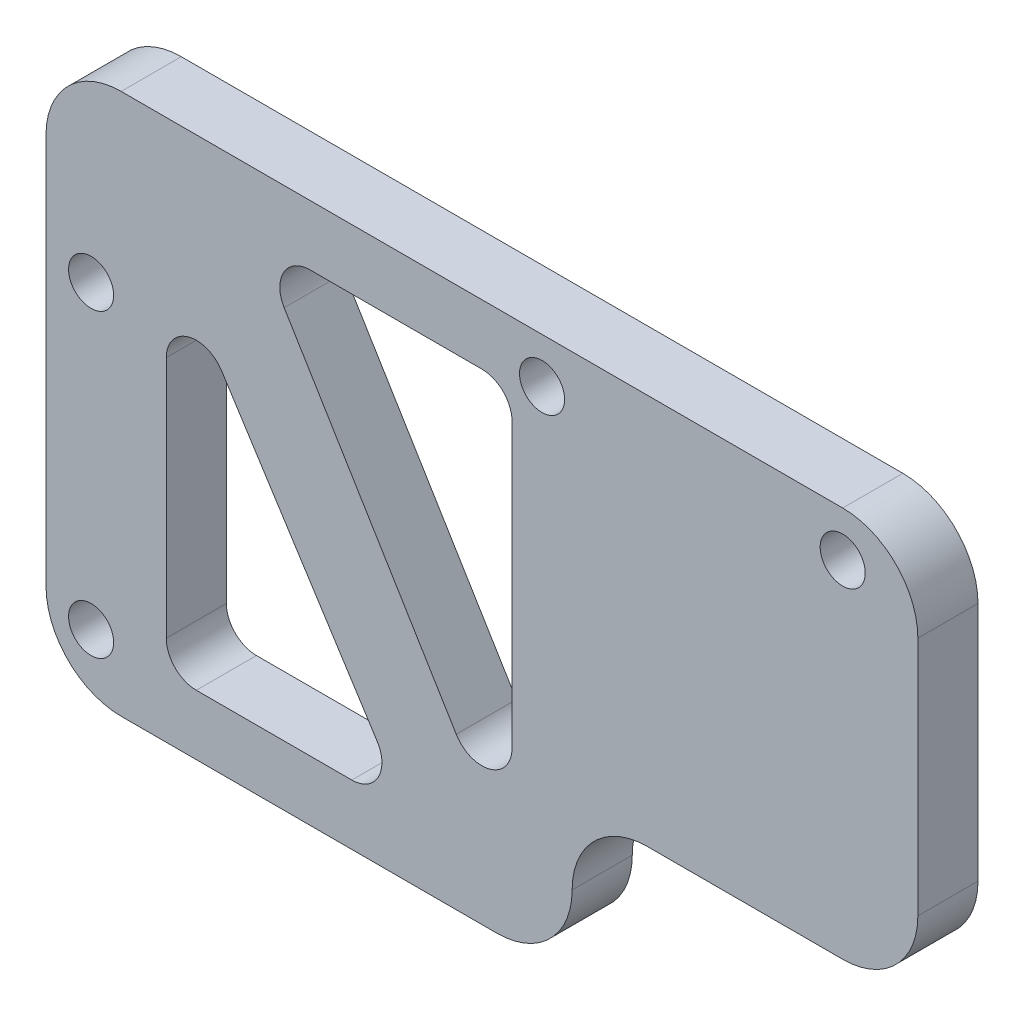
ISO-10303-21;
HEADER;
FILE_DESCRIPTION(('STEP AP214'),'2;1');
FILE_NAME('part.step','',(''),(''),'','','');
FILE_SCHEMA(('AUTOMOTIVE_DESIGN { 1 0 10303 214 1 1 1 1 }'));
ENDSEC;
DATA;
#1=APPLICATION_CONTEXT('core data for automotive mechanical design processes');
#2=APPLICATION_PROTOCOL_DEFINITION('international standard','automotive_design',2000,#1);
#3=PRODUCT_CONTEXT('',#1,'mechanical');
#4=PRODUCT('Part','Part','',(#3));
#5=PRODUCT_RELATED_PRODUCT_CATEGORY('part','',(#4));
#6=PRODUCT_DEFINITION_FORMATION('','',#4);
#7=PRODUCT_DEFINITION_CONTEXT('part definition',#1,'design');
#8=PRODUCT_DEFINITION('design','',#6,#7);
#9=PRODUCT_DEFINITION_SHAPE('','',#8);
#10=(LENGTH_UNIT() NAMED_UNIT(*) SI_UNIT(.MILLI.,.METRE.));
#11=(NAMED_UNIT(*) PLANE_ANGLE_UNIT() SI_UNIT($,.RADIAN.));
#12=(NAMED_UNIT(*) SI_UNIT($,.STERADIAN.) SOLID_ANGLE_UNIT());
#13=UNCERTAINTY_MEASURE_WITH_UNIT(LENGTH_MEASURE(1.E-05),#10,'distance_accuracy_value','');
#14=(GEOMETRIC_REPRESENTATION_CONTEXT(3) GLOBAL_UNCERTAINTY_ASSIGNED_CONTEXT((#13)) GLOBAL_UNIT_ASSIGNED_CONTEXT((#10,
#11,#12)) REPRESENTATION_CONTEXT('',''));
#15=CARTESIAN_POINT('',(0.,0.,0.));
#16=DIRECTION('',(0.,0.,1.));
#17=DIRECTION('',(1.,0.,0.));
#18=AXIS2_PLACEMENT_3D('',#15,#16,#17);
#19=CARTESIAN_POINT('',(0.,0.,4.));
#20=DIRECTION('',(0.,0.,-1.));
#21=DIRECTION('',(-1.,0.,0.));
#22=AXIS2_PLACEMENT_3D('',#19,#20,#21);
#23=PLANE('',#22);
#24=DIRECTION('',(0.,-1.,0.));
#25=VECTOR('',#24,1.);
#26=CARTESIAN_POINT('',(8.,0.,4.));
#27=LINE('',#26,#25);
#28=CARTESIAN_POINT('',(8.,22.164794480086,4.));
#29=VERTEX_POINT('',#28);
#30=CARTESIAN_POINT('',(8.,6.,4.));
#31=VERTEX_POINT('',#30);
#32=EDGE_CURVE('E415',#29,#31,#27,.T.);
#33=ORIENTED_EDGE('',*,*,#32,.F.);
#34=CARTESIAN_POINT('',(10.,22.164794480086,4.));
#35=DIRECTION('',(0.,0.,-1.));
#36=DIRECTION('',(-1.,0.,0.));
#37=AXIS2_PLACEMENT_3D('',#34,#35,#36);
#38=CIRCLE('',#37,2.);
#39=CARTESIAN_POINT('',(11.684542801323,23.2429018729328,4.));
#40=VERTEX_POINT('',#39);
#41=EDGE_CURVE('E307',#29,#40,#38,.T.);
#42=ORIENTED_EDGE('',*,*,#41,.T.);
#43=DIRECTION('',(-0.539053696423367,0.842271400661511,0.));
#44=VECTOR('',#43,1.);
#45=CARTESIAN_POINT('',(18.8422247446084,12.0590238365494,4.));
#46=LINE('',#45,#44);
#47=CARTESIAN_POINT('',(22.0300112685781,7.07810739284674,4.));
#48=VERTEX_POINT('',#47);
#49=EDGE_CURVE('E419',#48,#40,#46,.T.);
#50=ORIENTED_EDGE('',*,*,#49,.F.);
#51=CARTESIAN_POINT('',(20.3454684672551,6.,4.));
#52=DIRECTION('',(0.,0.,-1.));
#53=DIRECTION('',(-1.,0.,0.));
#54=AXIS2_PLACEMENT_3D('',#51,#52,#53);
#55=CIRCLE('',#54,2.);
#56=CARTESIAN_POINT('',(20.3454684672551,4.,4.));
#57=VERTEX_POINT('',#56);
#58=EDGE_CURVE('E299',#48,#57,#55,.T.);
#59=ORIENTED_EDGE('',*,*,#58,.T.);
#60=DIRECTION('',(1.,0.,0.));
#61=VECTOR('',#60,1.);
#62=CARTESIAN_POINT('',(0.,4.,4.));
#63=LINE('',#62,#61);
#64=CARTESIAN_POINT('',(10.,4.,4.));
#65=VERTEX_POINT('',#64);
#66=EDGE_CURVE('E331',#65,#57,#63,.T.);
#67=ORIENTED_EDGE('',*,*,#66,.F.);
#68=CARTESIAN_POINT('',(10.,6.,4.));
#69=DIRECTION('',(0.,0.,-1.));
#70=DIRECTION('',(-1.,0.,0.));
#71=AXIS2_PLACEMENT_3D('',#68,#69,#70);
#72=CIRCLE('',#71,2.);
#73=EDGE_CURVE('E303',#65,#31,#72,.T.);
#74=ORIENTED_EDGE('',*,*,#73,.T.);
#75=EDGE_LOOP('',(#33,#42,#50,#59,#67,#74));
#76=FACE_BOUND('',#75,.T.);
#77=DIRECTION('',(-1.,0.,0.));
#78=VECTOR('',#77,1.);
#79=CARTESIAN_POINT('',(135.,10.,4.));
#80=LINE('',#79,#78);
#81=CARTESIAN_POINT('',(53.,9.99999999999999,4.));
#82=VERTEX_POINT('',#81);
#83=CARTESIAN_POINT('',(40.,9.99999999999999,4.));
#84=VERTEX_POINT('',#83);
#85=EDGE_CURVE('E224',#82,#84,#80,.T.);
#86=ORIENTED_EDGE('',*,*,#85,.F.);
#87=CARTESIAN_POINT('',(53.,15.,4.));
#88=DIRECTION('',(0.,0.,-1.));
#89=DIRECTION('',(-1.,0.,0.));
#90=AXIS2_PLACEMENT_3D('',#87,#88,#89);
#91=CIRCLE('',#90,5.);
#92=CARTESIAN_POINT('',(58.,15.,4.));
#93=VERTEX_POINT('',#92);
#94=EDGE_CURVE('E315',#82,#93,#91,.F.);
#95=ORIENTED_EDGE('',*,*,#94,.T.);
#96=DIRECTION('',(0.,-1.,0.));
#97=VECTOR('',#96,1.);
#98=CARTESIAN_POINT('',(58.,36.,4.));
#99=LINE('',#98,#97);
#100=CARTESIAN_POINT('',(58.,31.,4.));
#101=VERTEX_POINT('',#100);
#102=EDGE_CURVE('E329',#101,#93,#99,.T.);
#103=ORIENTED_EDGE('',*,*,#102,.F.);
#104=CARTESIAN_POINT('',(53.,31.,4.));
#105=DIRECTION('',(0.,0.,-1.));
#106=DIRECTION('',(-1.,0.,0.));
#107=AXIS2_PLACEMENT_3D('',#104,#105,#106);
#108=CIRCLE('',#107,5.);
#109=CARTESIAN_POINT('',(53.,36.,4.));
#110=VERTEX_POINT('',#109);
#111=EDGE_CURVE('E313',#101,#110,#108,.F.);
#112=ORIENTED_EDGE('',*,*,#111,.T.);
#113=DIRECTION('',(-1.,0.,0.));
#114=VECTOR('',#113,1.);
#115=CARTESIAN_POINT('',(35.,36.,4.));
#116=LINE('',#115,#114);
#117=CARTESIAN_POINT('',(5.,36.,4.));
#118=VERTEX_POINT('',#117);
#119=EDGE_CURVE('E350',#110,#118,#116,.T.);
#120=ORIENTED_EDGE('',*,*,#119,.T.);
#121=CARTESIAN_POINT('',(5.,31.,4.));
#122=DIRECTION('',(0.,0.,-1.));
#123=DIRECTION('',(-1.,0.,0.));
#124=AXIS2_PLACEMENT_3D('',#121,#122,#123);
#125=CIRCLE('',#124,5.);
#126=CARTESIAN_POINT('',(0.,31.,4.));
#127=VERTEX_POINT('',#126);
#128=EDGE_CURVE('E368',#118,#127,#125,.F.);
#129=ORIENTED_EDGE('',*,*,#128,.T.);
#130=DIRECTION('',(0.,-1.,0.));
#131=VECTOR('',#130,1.);
#132=CARTESIAN_POINT('',(0.,0.,4.));
#133=LINE('',#132,#131);
#134=CARTESIAN_POINT('',(0.,5.,4.));
#135=VERTEX_POINT('',#134);
#136=EDGE_CURVE('E236',#127,#135,#133,.T.);
#137=ORIENTED_EDGE('',*,*,#136,.T.);
#138=CARTESIAN_POINT('',(5.,5.,4.));
#139=DIRECTION('',(0.,0.,-1.));
#140=DIRECTION('',(-1.,0.,0.));
#141=AXIS2_PLACEMENT_3D('',#138,#139,#140);
#142=CIRCLE('',#141,5.);
#143=CARTESIAN_POINT('',(5.,0.,4.));
#144=VERTEX_POINT('',#143);
#145=EDGE_CURVE('E366',#135,#144,#142,.F.);
#146=ORIENTED_EDGE('',*,*,#145,.T.);
#147=DIRECTION('',(1.,0.,0.));
#148=VECTOR('',#147,1.);
#149=CARTESIAN_POINT('',(135.,0.,4.));
#150=LINE('',#149,#148);
#151=CARTESIAN_POINT('',(30.,0.,4.));
#152=VERTEX_POINT('',#151);
#153=EDGE_CURVE('E347',#144,#152,#150,.T.);
#154=ORIENTED_EDGE('',*,*,#153,.T.);
#155=CARTESIAN_POINT('',(30.,5.,4.));
#156=DIRECTION('',(0.,0.,-1.));
#157=DIRECTION('',(-1.,0.,0.));
#158=AXIS2_PLACEMENT_3D('',#155,#156,#157);
#159=CIRCLE('',#158,5.);
#160=CARTESIAN_POINT('',(35.,5.,4.));
#161=VERTEX_POINT('',#160);
#162=EDGE_CURVE('E229',#152,#161,#159,.F.);
#163=ORIENTED_EDGE('',*,*,#162,.T.);
#164=CARTESIAN_POINT('',(40.,4.99999999999999,4.));
#165=DIRECTION('',(0.,0.,-1.));
#166=DIRECTION('',(-1.,0.,0.));
#167=AXIS2_PLACEMENT_3D('',#164,#165,#166);
#168=CIRCLE('',#167,5.);
#169=EDGE_CURVE('E243',#161,#84,#168,.T.);
#170=ORIENTED_EDGE('',*,*,#169,.T.);
#171=EDGE_LOOP('',(#86,#95,#103,#112,#120,#129,#137,#146,#154,#163,#170));
#172=FACE_BOUND('',#171,.T.);
#173=CARTESIAN_POINT('',(3.,24.,4.));
#174=DIRECTION('',(0.,0.,1.));
#175=DIRECTION('',(1.,0.,0.));
#176=AXIS2_PLACEMENT_3D('',#173,#174,#175);
#177=CIRCLE('',#176,1.5);
#178=CARTESIAN_POINT('',(4.5,24.,4.));
#179=VERTEX_POINT('',#178);
#180=EDGE_CURVE('E336',#179,#179,#177,.T.);
#181=ORIENTED_EDGE('',*,*,#180,.F.);
#182=EDGE_LOOP('',(#181));
#183=FACE_BOUND('',#182,.T.);
#184=CARTESIAN_POINT('',(3.,4.,4.));
#185=DIRECTION('',(0.,0.,1.));
#186=DIRECTION('',(1.,0.,0.));
#187=AXIS2_PLACEMENT_3D('',#184,#185,#186);
#188=CIRCLE('',#187,1.5);
#189=CARTESIAN_POINT('',(4.5,4.,4.));
#190=VERTEX_POINT('',#189);
#191=EDGE_CURVE('E339',#190,#190,#188,.T.);
#192=ORIENTED_EDGE('',*,*,#191,.F.);
#193=EDGE_LOOP('',(#192));
#194=FACE_BOUND('',#193,.T.);
#195=CARTESIAN_POINT('',(53.,33.,4.));
#196=DIRECTION('',(0.,0.,1.));
#197=DIRECTION('',(1.,0.,0.));
#198=AXIS2_PLACEMENT_3D('',#195,#196,#197);
#199=CIRCLE('',#198,1.50000000000005);
#200=CARTESIAN_POINT('',(54.5000000000001,33.,4.));
#201=VERTEX_POINT('',#200);
#202=EDGE_CURVE('E255',#201,#201,#199,.T.);
#203=ORIENTED_EDGE('',*,*,#202,.F.);
#204=EDGE_LOOP('',(#203));
#205=FACE_BOUND('',#204,.T.);
#206=CARTESIAN_POINT('',(33.,33.,4.));
#207=DIRECTION('',(0.,0.,1.));
#208=DIRECTION('',(1.,0.,0.));
#209=AXIS2_PLACEMENT_3D('',#206,#207,#208);
#210=CIRCLE('',#209,1.5);
#211=CARTESIAN_POINT('',(34.5,33.,4.));
#212=VERTEX_POINT('',#211);
#213=EDGE_CURVE('E258',#212,#212,#210,.T.);
#214=ORIENTED_EDGE('',*,*,#213,.F.);
#215=EDGE_LOOP('',(#214));
#216=FACE_BOUND('',#215,.T.);
#217=DIRECTION('',(0.,-1.,0.));
#218=VECTOR('',#217,1.);
#219=CARTESIAN_POINT('',(31.,0.,4.));
#220=LINE('',#219,#218);
#221=CARTESIAN_POINT('',(31.,30.,4.));
#222=VERTEX_POINT('',#221);
#223=CARTESIAN_POINT('',(31.,11.1478445539198,4.));
#224=VERTEX_POINT('',#223);
#225=EDGE_CURVE('E436',#222,#224,#220,.T.);
#226=ORIENTED_EDGE('',*,*,#225,.T.);
#227=CARTESIAN_POINT('',(29.,11.1478445539198,4.));
#228=DIRECTION('',(0.,0.,-1.));
#229=DIRECTION('',(-1.,0.,0.));
#230=AXIS2_PLACEMENT_3D('',#227,#228,#229);
#231=CIRCLE('',#230,2.);
#232=CARTESIAN_POINT('',(27.2904249695565,10.1098882854363,4.));
#233=VERTEX_POINT('',#232);
#234=EDGE_CURVE('E291',#224,#233,#231,.T.);
#235=ORIENTED_EDGE('',*,*,#234,.T.);
#236=DIRECTION('',(-0.518978134241764,0.854787515221729,0.));
#237=VECTOR('',#236,1.);
#238=CARTESIAN_POINT('',(24.4249767008388,14.829450139795,4.));
#239=LINE('',#238,#237);
#240=CARTESIAN_POINT('',(15.8444734487221,28.9620437315165,4.));
#241=VERTEX_POINT('',#240);
#242=EDGE_CURVE('E430',#233,#241,#239,.T.);
#243=ORIENTED_EDGE('',*,*,#242,.T.);
#244=CARTESIAN_POINT('',(17.5540484791656,30.,4.));
#245=DIRECTION('',(0.,0.,-1.));
#246=DIRECTION('',(-1.,0.,0.));
#247=AXIS2_PLACEMENT_3D('',#244,#245,#246);
#248=CIRCLE('',#247,2.);
#249=CARTESIAN_POINT('',(17.5540484791656,32.,4.));
#250=VERTEX_POINT('',#249);
#251=EDGE_CURVE('E295',#241,#250,#248,.T.);
#252=ORIENTED_EDGE('',*,*,#251,.T.);
#253=DIRECTION('',(1.,0.,0.));
#254=VECTOR('',#253,1.);
#255=CARTESIAN_POINT('',(0.,32.,4.));
#256=LINE('',#255,#254);
#257=CARTESIAN_POINT('',(29.,32.,4.));
#258=VERTEX_POINT('',#257);
#259=EDGE_CURVE('E433',#250,#258,#256,.T.);
#260=ORIENTED_EDGE('',*,*,#259,.T.);
#261=CARTESIAN_POINT('',(29.,30.,4.));
#262=DIRECTION('',(0.,0.,-1.));
#263=DIRECTION('',(-1.,0.,0.));
#264=AXIS2_PLACEMENT_3D('',#261,#262,#263);
#265=CIRCLE('',#264,2.);
#266=EDGE_CURVE('E287',#258,#222,#265,.T.);
#267=ORIENTED_EDGE('',*,*,#266,.T.);
#268=EDGE_LOOP('',(#226,#235,#243,#252,#260,#267));
#269=FACE_BOUND('',#268,.T.);
#270=ADVANCED_FACE('F62',(#76,#172,#183,#194,#205,#216,#269),#23,.F.);
#271=CARTESIAN_POINT('',(0.,0.,0.));
#272=DIRECTION('',(0.,0.,-1.));
#273=DIRECTION('',(-1.,0.,0.));
#274=AXIS2_PLACEMENT_3D('',#271,#272,#273);
#275=PLANE('',#274);
#276=DIRECTION('',(0.,1.,0.));
#277=VECTOR('',#276,1.);
#278=CARTESIAN_POINT('',(58.,0.,0.));
#279=LINE('',#278,#277);
#280=CARTESIAN_POINT('',(58.,15.,0.));
#281=VERTEX_POINT('',#280);
#282=CARTESIAN_POINT('',(58.,31.,0.));
#283=VERTEX_POINT('',#282);
#284=EDGE_CURVE('E326',#281,#283,#279,.T.);
#285=ORIENTED_EDGE('',*,*,#284,.F.);
#286=CARTESIAN_POINT('',(53.,15.,0.));
#287=DIRECTION('',(0.,0.,-1.));
#288=DIRECTION('',(-1.,0.,0.));
#289=AXIS2_PLACEMENT_3D('',#286,#287,#288);
#290=CIRCLE('',#289,5.);
#291=CARTESIAN_POINT('',(53.,9.99999999999999,0.));
#292=VERTEX_POINT('',#291);
#293=EDGE_CURVE('E70',#281,#292,#290,.T.);
#294=ORIENTED_EDGE('',*,*,#293,.T.);
#295=DIRECTION('',(1.,0.,0.));
#296=VECTOR('',#295,1.);
#297=CARTESIAN_POINT('',(0.,9.99999999999999,0.));
#298=LINE('',#297,#296);
#299=CARTESIAN_POINT('',(40.,9.99999999999999,0.));
#300=VERTEX_POINT('',#299);
#301=EDGE_CURVE('E221',#300,#292,#298,.T.);
#302=ORIENTED_EDGE('',*,*,#301,.F.);
#303=CARTESIAN_POINT('',(40.,4.99999999999999,0.));
#304=DIRECTION('',(0.,0.,-1.));
#305=DIRECTION('',(-1.,0.,0.));
#306=AXIS2_PLACEMENT_3D('',#303,#304,#305);
#307=CIRCLE('',#306,5.);
#308=CARTESIAN_POINT('',(35.,5.,0.));
#309=VERTEX_POINT('',#308);
#310=EDGE_CURVE('E233',#300,#309,#307,.F.);
#311=ORIENTED_EDGE('',*,*,#310,.T.);
#312=CARTESIAN_POINT('',(30.,5.,0.));
#313=DIRECTION('',(0.,0.,-1.));
#314=DIRECTION('',(-1.,0.,0.));
#315=AXIS2_PLACEMENT_3D('',#312,#313,#314);
#316=CIRCLE('',#315,5.);
#317=CARTESIAN_POINT('',(30.,0.,0.));
#318=VERTEX_POINT('',#317);
#319=EDGE_CURVE('E370',#309,#318,#316,.T.);
#320=ORIENTED_EDGE('',*,*,#319,.T.);
#321=DIRECTION('',(1.,0.,0.));
#322=VECTOR('',#321,1.);
#323=CARTESIAN_POINT('',(135.,0.,0.));
#324=LINE('',#323,#322);
#325=CARTESIAN_POINT('',(5.,0.,0.));
#326=VERTEX_POINT('',#325);
#327=EDGE_CURVE('E354',#326,#318,#324,.T.);
#328=ORIENTED_EDGE('',*,*,#327,.F.);
#329=CARTESIAN_POINT('',(5.,5.,0.));
#330=DIRECTION('',(0.,0.,-1.));
#331=DIRECTION('',(-1.,0.,0.));
#332=AXIS2_PLACEMENT_3D('',#329,#330,#331);
#333=CIRCLE('',#332,5.);
#334=CARTESIAN_POINT('',(0.,5.,0.));
#335=VERTEX_POINT('',#334);
#336=EDGE_CURVE('E372',#326,#335,#333,.T.);
#337=ORIENTED_EDGE('',*,*,#336,.T.);
#338=DIRECTION('',(0.,-1.,0.));
#339=VECTOR('',#338,1.);
#340=CARTESIAN_POINT('',(0.,0.,0.));
#341=LINE('',#340,#339);
#342=CARTESIAN_POINT('',(0.,31.,0.));
#343=VERTEX_POINT('',#342);
#344=EDGE_CURVE('E351',#343,#335,#341,.T.);
#345=ORIENTED_EDGE('',*,*,#344,.F.);
#346=CARTESIAN_POINT('',(5.,31.,0.));
#347=DIRECTION('',(0.,0.,-1.));
#348=DIRECTION('',(-1.,0.,0.));
#349=AXIS2_PLACEMENT_3D('',#346,#347,#348);
#350=CIRCLE('',#349,5.);
#351=CARTESIAN_POINT('',(5.,36.,0.));
#352=VERTEX_POINT('',#351);
#353=EDGE_CURVE('E375',#343,#352,#350,.T.);
#354=ORIENTED_EDGE('',*,*,#353,.T.);
#355=DIRECTION('',(-1.,0.,0.));
#356=VECTOR('',#355,1.);
#357=CARTESIAN_POINT('',(0.,36.,0.));
#358=LINE('',#357,#356);
#359=CARTESIAN_POINT('',(53.,36.,0.));
#360=VERTEX_POINT('',#359);
#361=EDGE_CURVE('E357',#360,#352,#358,.T.);
#362=ORIENTED_EDGE('',*,*,#361,.F.);
#363=CARTESIAN_POINT('',(53.,31.,0.));
#364=DIRECTION('',(0.,0.,-1.));
#365=DIRECTION('',(-1.,0.,0.));
#366=AXIS2_PLACEMENT_3D('',#363,#364,#365);
#367=CIRCLE('',#366,5.);
#368=EDGE_CURVE('E82',#360,#283,#367,.T.);
#369=ORIENTED_EDGE('',*,*,#368,.T.);
#370=EDGE_LOOP('',(#285,#294,#302,#311,#320,#328,#337,#345,#354,#362,#369));
#371=FACE_BOUND('',#370,.T.);
#372=DIRECTION('',(1.,0.,0.));
#373=VECTOR('',#372,1.);
#374=CARTESIAN_POINT('',(0.,4.,0.));
#375=LINE('',#374,#373);
#376=CARTESIAN_POINT('',(10.,4.,0.));
#377=VERTEX_POINT('',#376);
#378=CARTESIAN_POINT('',(20.3454684672551,4.,0.));
#379=VERTEX_POINT('',#378);
#380=EDGE_CURVE('E427',#377,#379,#375,.T.);
#381=ORIENTED_EDGE('',*,*,#380,.T.);
#382=CARTESIAN_POINT('',(20.3454684672551,6.,0.));
#383=DIRECTION('',(0.,0.,-1.));
#384=DIRECTION('',(-1.,0.,0.));
#385=AXIS2_PLACEMENT_3D('',#382,#383,#384);
#386=CIRCLE('',#385,2.);
#387=CARTESIAN_POINT('',(22.0300112685781,7.07810739284674,0.));
#388=VERTEX_POINT('',#387);
#389=EDGE_CURVE('E301',#379,#388,#386,.F.);
#390=ORIENTED_EDGE('',*,*,#389,.T.);
#391=DIRECTION('',(-0.539053696423367,0.842271400661511,0.));
#392=VECTOR('',#391,1.);
#393=CARTESIAN_POINT('',(18.8422247446084,12.0590238365494,0.));
#394=LINE('',#393,#392);
#395=CARTESIAN_POINT('',(11.684542801323,23.2429018729328,0.));
#396=VERTEX_POINT('',#395);
#397=EDGE_CURVE('E418',#388,#396,#394,.T.);
#398=ORIENTED_EDGE('',*,*,#397,.T.);
#399=CARTESIAN_POINT('',(10.,22.164794480086,0.));
#400=DIRECTION('',(0.,0.,-1.));
#401=DIRECTION('',(-1.,0.,0.));
#402=AXIS2_PLACEMENT_3D('',#399,#400,#401);
#403=CIRCLE('',#402,2.);
#404=CARTESIAN_POINT('',(8.,22.164794480086,0.));
#405=VERTEX_POINT('',#404);
#406=EDGE_CURVE('E309',#396,#405,#403,.F.);
#407=ORIENTED_EDGE('',*,*,#406,.T.);
#408=DIRECTION('',(0.,-1.,0.));
#409=VECTOR('',#408,1.);
#410=CARTESIAN_POINT('',(8.,0.,0.));
#411=LINE('',#410,#409);
#412=CARTESIAN_POINT('',(8.,6.,0.));
#413=VERTEX_POINT('',#412);
#414=EDGE_CURVE('E426',#405,#413,#411,.T.);
#415=ORIENTED_EDGE('',*,*,#414,.T.);
#416=CARTESIAN_POINT('',(10.,6.,0.));
#417=DIRECTION('',(0.,0.,-1.));
#418=DIRECTION('',(-1.,0.,0.));
#419=AXIS2_PLACEMENT_3D('',#416,#417,#418);
#420=CIRCLE('',#419,2.);
#421=EDGE_CURVE('E305',#413,#377,#420,.F.);
#422=ORIENTED_EDGE('',*,*,#421,.T.);
#423=EDGE_LOOP('',(#381,#390,#398,#407,#415,#422));
#424=FACE_BOUND('',#423,.T.);
#425=CARTESIAN_POINT('',(33.,33.,0.));
#426=DIRECTION('',(0.,0.,-1.));
#427=DIRECTION('',(-1.,0.,0.));
#428=AXIS2_PLACEMENT_3D('',#425,#426,#427);
#429=CIRCLE('',#428,1.5);
#430=CARTESIAN_POINT('',(31.5,33.,0.));
#431=VERTEX_POINT('',#430);
#432=EDGE_CURVE('E256',#431,#431,#429,.T.);
#433=ORIENTED_EDGE('',*,*,#432,.F.);
#434=EDGE_LOOP('',(#433));
#435=FACE_BOUND('',#434,.T.);
#436=CARTESIAN_POINT('',(53.,33.,0.));
#437=DIRECTION('',(0.,0.,-1.));
#438=DIRECTION('',(-1.,0.,0.));
#439=AXIS2_PLACEMENT_3D('',#436,#437,#438);
#440=CIRCLE('',#439,1.50000000000005);
#441=CARTESIAN_POINT('',(51.5,33.,0.));
#442=VERTEX_POINT('',#441);
#443=EDGE_CURVE('E252',#442,#442,#440,.T.);
#444=ORIENTED_EDGE('',*,*,#443,.F.);
#445=EDGE_LOOP('',(#444));
#446=FACE_BOUND('',#445,.T.);
#447=CARTESIAN_POINT('',(3.,4.,0.));
#448=DIRECTION('',(0.,0.,-1.));
#449=DIRECTION('',(-1.,0.,0.));
#450=AXIS2_PLACEMENT_3D('',#447,#448,#449);
#451=CIRCLE('',#450,1.5);
#452=CARTESIAN_POINT('',(1.5,4.,0.));
#453=VERTEX_POINT('',#452);
#454=EDGE_CURVE('E358',#453,#453,#451,.T.);
#455=ORIENTED_EDGE('',*,*,#454,.F.);
#456=EDGE_LOOP('',(#455));
#457=FACE_BOUND('',#456,.T.);
#458=CARTESIAN_POINT('',(3.,24.,0.));
#459=DIRECTION('',(0.,0.,-1.));
#460=DIRECTION('',(-1.,0.,0.));
#461=AXIS2_PLACEMENT_3D('',#458,#459,#460);
#462=CIRCLE('',#461,1.5);
#463=CARTESIAN_POINT('',(1.5,24.,0.));
#464=VERTEX_POINT('',#463);
#465=EDGE_CURVE('E345',#464,#464,#462,.T.);
#466=ORIENTED_EDGE('',*,*,#465,.F.);
#467=EDGE_LOOP('',(#466));
#468=FACE_BOUND('',#467,.T.);
#469=DIRECTION('',(1.,0.,0.));
#470=VECTOR('',#469,1.);
#471=CARTESIAN_POINT('',(0.,32.,0.));
#472=LINE('',#471,#470);
#473=CARTESIAN_POINT('',(17.5540484791656,32.,0.));
#474=VERTEX_POINT('',#473);
#475=CARTESIAN_POINT('',(29.,32.,0.));
#476=VERTEX_POINT('',#475);
#477=EDGE_CURVE('E442',#474,#476,#472,.T.);
#478=ORIENTED_EDGE('',*,*,#477,.F.);
#479=CARTESIAN_POINT('',(17.5540484791656,30.,0.));
#480=DIRECTION('',(0.,0.,-1.));
#481=DIRECTION('',(-1.,0.,0.));
#482=AXIS2_PLACEMENT_3D('',#479,#480,#481);
#483=CIRCLE('',#482,2.);
#484=CARTESIAN_POINT('',(15.8444734487221,28.9620437315165,0.));
#485=VERTEX_POINT('',#484);
#486=EDGE_CURVE('E297',#474,#485,#483,.F.);
#487=ORIENTED_EDGE('',*,*,#486,.T.);
#488=DIRECTION('',(-0.518978134241764,0.854787515221729,0.));
#489=VECTOR('',#488,1.);
#490=CARTESIAN_POINT('',(24.4249767008388,14.829450139795,0.));
#491=LINE('',#490,#489);
#492=CARTESIAN_POINT('',(27.2904249695565,10.1098882854363,0.));
#493=VERTEX_POINT('',#492);
#494=EDGE_CURVE('E445',#493,#485,#491,.T.);
#495=ORIENTED_EDGE('',*,*,#494,.F.);
#496=CARTESIAN_POINT('',(29.,11.1478445539198,0.));
#497=DIRECTION('',(0.,0.,-1.));
#498=DIRECTION('',(-1.,0.,0.));
#499=AXIS2_PLACEMENT_3D('',#496,#497,#498);
#500=CIRCLE('',#499,2.);
#501=CARTESIAN_POINT('',(31.,11.1478445539198,0.));
#502=VERTEX_POINT('',#501);
#503=EDGE_CURVE('E293',#493,#502,#500,.F.);
#504=ORIENTED_EDGE('',*,*,#503,.T.);
#505=DIRECTION('',(0.,-1.,0.));
#506=VECTOR('',#505,1.);
#507=CARTESIAN_POINT('',(31.,0.,0.));
#508=LINE('',#507,#506);
#509=CARTESIAN_POINT('',(31.,30.,0.));
#510=VERTEX_POINT('',#509);
#511=EDGE_CURVE('E439',#510,#502,#508,.T.);
#512=ORIENTED_EDGE('',*,*,#511,.F.);
#513=CARTESIAN_POINT('',(29.,30.,0.));
#514=DIRECTION('',(0.,0.,-1.));
#515=DIRECTION('',(-1.,0.,0.));
#516=AXIS2_PLACEMENT_3D('',#513,#514,#515);
#517=CIRCLE('',#516,2.);
#518=EDGE_CURVE('E289',#510,#476,#517,.F.);
#519=ORIENTED_EDGE('',*,*,#518,.T.);
#520=EDGE_LOOP('',(#478,#487,#495,#504,#512,#519));
#521=FACE_BOUND('',#520,.T.);
#522=ADVANCED_FACE('F231',(#371,#424,#435,#446,#457,#468,#521),#275,.T.);
#523=CARTESIAN_POINT('',(135.,0.,4.));
#524=DIRECTION('',(0.,1.,0.));
#525=DIRECTION('',(-1.,0.,0.));
#526=AXIS2_PLACEMENT_3D('',#523,#524,#525);
#527=PLANE('',#526);
#528=ORIENTED_EDGE('',*,*,#153,.F.);
#529=DIRECTION('',(0.,0.,-1.));
#530=VECTOR('',#529,1.);
#531=CARTESIAN_POINT('',(5.,0.,4.));
#532=LINE('',#531,#530);
#533=EDGE_CURVE('E247',#144,#326,#532,.T.);
#534=ORIENTED_EDGE('',*,*,#533,.T.);
#535=ORIENTED_EDGE('',*,*,#327,.T.);
#536=DIRECTION('',(0.,0.,1.));
#537=VECTOR('',#536,1.);
#538=CARTESIAN_POINT('',(30.,0.,4.));
#539=LINE('',#538,#537);
#540=EDGE_CURVE('E387',#318,#152,#539,.T.);
#541=ORIENTED_EDGE('',*,*,#540,.T.);
#542=EDGE_LOOP('',(#528,#534,#535,#541));
#543=FACE_BOUND('',#542,.T.);
#544=ADVANCED_FACE('F394',(#543),#527,.F.);
#545=CARTESIAN_POINT('',(0.,36.,4.));
#546=DIRECTION('',(0.,-1.,0.));
#547=DIRECTION('',(0.,0.,-1.));
#548=AXIS2_PLACEMENT_3D('',#545,#546,#547);
#549=PLANE('',#548);
#550=ORIENTED_EDGE('',*,*,#119,.F.);
#551=DIRECTION('',(0.,0.,1.));
#552=VECTOR('',#551,1.);
#553=CARTESIAN_POINT('',(53.,36.,4.));
#554=LINE('',#553,#552);
#555=EDGE_CURVE('E12',#110,#360,#554,.F.);
#556=ORIENTED_EDGE('',*,*,#555,.T.);
#557=ORIENTED_EDGE('',*,*,#361,.T.);
#558=DIRECTION('',(0.,0.,-1.));
#559=VECTOR('',#558,1.);
#560=CARTESIAN_POINT('',(5.,36.,4.));
#561=LINE('',#560,#559);
#562=EDGE_CURVE('E378',#352,#118,#561,.F.);
#563=ORIENTED_EDGE('',*,*,#562,.T.);
#564=EDGE_LOOP('',(#550,#556,#557,#563));
#565=FACE_BOUND('',#564,.T.);
#566=ADVANCED_FACE('F411',(#565),#549,.F.);
#567=CARTESIAN_POINT('',(0.,0.,4.));
#568=DIRECTION('',(1.,0.,0.));
#569=DIRECTION('',(0.,0.,-1.));
#570=AXIS2_PLACEMENT_3D('',#567,#568,#569);
#571=PLANE('',#570);
#572=ORIENTED_EDGE('',*,*,#344,.T.);
#573=DIRECTION('',(0.,0.,-1.));
#574=VECTOR('',#573,1.);
#575=CARTESIAN_POINT('',(0.,5.,4.));
#576=LINE('',#575,#574);
#577=EDGE_CURVE('E381',#335,#135,#576,.F.);
#578=ORIENTED_EDGE('',*,*,#577,.T.);
#579=ORIENTED_EDGE('',*,*,#136,.F.);
#580=DIRECTION('',(0.,0.,-1.));
#581=VECTOR('',#580,1.);
#582=CARTESIAN_POINT('',(0.,31.,4.));
#583=LINE('',#582,#581);
#584=EDGE_CURVE('E384',#127,#343,#583,.T.);
#585=ORIENTED_EDGE('',*,*,#584,.T.);
#586=EDGE_LOOP('',(#572,#578,#579,#585));
#587=FACE_BOUND('',#586,.T.);
#588=ADVANCED_FACE('F405',(#587),#571,.F.);
#589=CARTESIAN_POINT('',(3.,24.,-6.));
#590=DIRECTION('',(0.,0.,1.));
#591=DIRECTION('',(1.,0.,0.));
#592=AXIS2_PLACEMENT_3D('',#589,#590,#591);
#593=CYLINDRICAL_SURFACE('',#592,1.5);
#594=ORIENTED_EDGE('',*,*,#465,.T.);
#595=EDGE_LOOP('',(#594));
#596=FACE_BOUND('',#595,.T.);
#597=ORIENTED_EDGE('',*,*,#180,.T.);
#598=EDGE_LOOP('',(#597));
#599=FACE_BOUND('',#598,.T.);
#600=ADVANCED_FACE('F546',(#596,#599),#593,.F.);
#601=CARTESIAN_POINT('',(3.,4.,-6.));
#602=DIRECTION('',(0.,0.,1.));
#603=DIRECTION('',(1.,0.,0.));
#604=AXIS2_PLACEMENT_3D('',#601,#602,#603);
#605=CYLINDRICAL_SURFACE('',#604,1.5);
#606=ORIENTED_EDGE('',*,*,#454,.T.);
#607=EDGE_LOOP('',(#606));
#608=FACE_BOUND('',#607,.T.);
#609=ORIENTED_EDGE('',*,*,#191,.T.);
#610=EDGE_LOOP('',(#609));
#611=FACE_BOUND('',#610,.T.);
#612=ADVANCED_FACE('F543',(#608,#611),#605,.F.);
#613=CARTESIAN_POINT('',(135.,10.,-6.));
#614=DIRECTION('',(0.,1.,0.));
#615=DIRECTION('',(-1.,0.,0.));
#616=AXIS2_PLACEMENT_3D('',#613,#614,#615);
#617=PLANE('',#616);
#618=ORIENTED_EDGE('',*,*,#301,.T.);
#619=DIRECTION('',(0.,0.,1.));
#620=VECTOR('',#619,1.);
#621=CARTESIAN_POINT('',(53.,9.99999999999999,-6.));
#622=LINE('',#621,#620);
#623=EDGE_CURVE('E311',#292,#82,#622,.T.);
#624=ORIENTED_EDGE('',*,*,#623,.T.);
#625=ORIENTED_EDGE('',*,*,#85,.T.);
#626=DIRECTION('',(0.,0.,1.));
#627=VECTOR('',#626,1.);
#628=CARTESIAN_POINT('',(40.,9.99999999999999,0.));
#629=LINE('',#628,#627);
#630=EDGE_CURVE('E217',#84,#300,#629,.F.);
#631=ORIENTED_EDGE('',*,*,#630,.T.);
#632=EDGE_LOOP('',(#618,#624,#625,#631));
#633=FACE_BOUND('',#632,.T.);
#634=ADVANCED_FACE('F219',(#633),#617,.F.);
#635=CARTESIAN_POINT('',(5.,31.,4.));
#636=DIRECTION('',(0.,0.,-1.));
#637=DIRECTION('',(-1.,0.,0.));
#638=AXIS2_PLACEMENT_3D('',#635,#636,#637);
#639=CYLINDRICAL_SURFACE('',#638,5.);
#640=ORIENTED_EDGE('',*,*,#128,.F.);
#641=ORIENTED_EDGE('',*,*,#562,.F.);
#642=ORIENTED_EDGE('',*,*,#353,.F.);
#643=ORIENTED_EDGE('',*,*,#584,.F.);
#644=EDGE_LOOP('',(#640,#641,#642,#643));
#645=FACE_BOUND('',#644,.T.);
#646=ADVANCED_FACE('F410',(#645),#639,.T.);
#647=CARTESIAN_POINT('',(5.,5.,4.));
#648=DIRECTION('',(0.,0.,-1.));
#649=DIRECTION('',(-1.,0.,0.));
#650=AXIS2_PLACEMENT_3D('',#647,#648,#649);
#651=CYLINDRICAL_SURFACE('',#650,5.);
#652=ORIENTED_EDGE('',*,*,#145,.F.);
#653=ORIENTED_EDGE('',*,*,#577,.F.);
#654=ORIENTED_EDGE('',*,*,#336,.F.);
#655=ORIENTED_EDGE('',*,*,#533,.F.);
#656=EDGE_LOOP('',(#652,#653,#654,#655));
#657=FACE_BOUND('',#656,.T.);
#658=ADVANCED_FACE('F403',(#657),#651,.T.);
#659=CARTESIAN_POINT('',(40.,4.99999999999999,-6.));
#660=DIRECTION('',(0.,0.,-1.));
#661=DIRECTION('',(-1.,0.,0.));
#662=AXIS2_PLACEMENT_3D('',#659,#660,#661);
#663=CYLINDRICAL_SURFACE('',#662,5.);
#664=DIRECTION('',(0.,0.,1.));
#665=VECTOR('',#664,1.);
#666=CARTESIAN_POINT('',(35.,4.99999999999999,4.));
#667=LINE('',#666,#665);
#668=EDGE_CURVE('E240',#309,#161,#667,.T.);
#669=ORIENTED_EDGE('',*,*,#668,.F.);
#670=ORIENTED_EDGE('',*,*,#310,.F.);
#671=ORIENTED_EDGE('',*,*,#630,.F.);
#672=ORIENTED_EDGE('',*,*,#169,.F.);
#673=EDGE_LOOP('',(#669,#670,#671,#672));
#674=FACE_BOUND('',#673,.T.);
#675=ADVANCED_FACE('F238',(#674),#663,.F.);
#676=CARTESIAN_POINT('',(30.,5.,4.));
#677=DIRECTION('',(0.,0.,1.));
#678=DIRECTION('',(1.,0.,0.));
#679=AXIS2_PLACEMENT_3D('',#676,#677,#678);
#680=CYLINDRICAL_SURFACE('',#679,5.);
#681=ORIENTED_EDGE('',*,*,#319,.F.);
#682=ORIENTED_EDGE('',*,*,#668,.T.);
#683=ORIENTED_EDGE('',*,*,#162,.F.);
#684=ORIENTED_EDGE('',*,*,#540,.F.);
#685=EDGE_LOOP('',(#681,#682,#683,#684));
#686=FACE_BOUND('',#685,.T.);
#687=ADVANCED_FACE('F401',(#686),#680,.T.);
#688=CARTESIAN_POINT('',(53.,33.,-2.));
#689=DIRECTION('',(0.,0.,1.));
#690=DIRECTION('',(1.,0.,0.));
#691=AXIS2_PLACEMENT_3D('',#688,#689,#690);
#692=CYLINDRICAL_SURFACE('',#691,1.50000000000005);
#693=ORIENTED_EDGE('',*,*,#443,.T.);
#694=EDGE_LOOP('',(#693));
#695=FACE_BOUND('',#694,.T.);
#696=ORIENTED_EDGE('',*,*,#202,.T.);
#697=EDGE_LOOP('',(#696));
#698=FACE_BOUND('',#697,.T.);
#699=ADVANCED_FACE('F536',(#695,#698),#692,.F.);
#700=CARTESIAN_POINT('',(33.,33.,-6.));
#701=DIRECTION('',(0.,0.,1.));
#702=DIRECTION('',(1.,0.,0.));
#703=AXIS2_PLACEMENT_3D('',#700,#701,#702);
#704=CYLINDRICAL_SURFACE('',#703,1.5);
#705=ORIENTED_EDGE('',*,*,#432,.T.);
#706=EDGE_LOOP('',(#705));
#707=FACE_BOUND('',#706,.T.);
#708=ORIENTED_EDGE('',*,*,#213,.T.);
#709=EDGE_LOOP('',(#708));
#710=FACE_BOUND('',#709,.T.);
#711=ADVANCED_FACE('F452',(#707,#710),#704,.F.);
#712=CARTESIAN_POINT('',(24.4249767008388,14.829450139795,-32.7566787083184));
#713=DIRECTION('',(0.854787515221729,0.518978134241764,0.));
#714=DIRECTION('',(-0.518978134241764,0.854787515221729,0.));
#715=AXIS2_PLACEMENT_3D('',#712,#713,#714);
#716=PLANE('',#715);
#717=ORIENTED_EDGE('',*,*,#242,.F.);
#718=DIRECTION('',(0.,0.,1.));
#719=VECTOR('',#718,1.);
#720=CARTESIAN_POINT('',(27.2904249695565,10.1098882854363,0.));
#721=LINE('',#720,#719);
#722=EDGE_CURVE('E270',#233,#493,#721,.F.);
#723=ORIENTED_EDGE('',*,*,#722,.T.);
#724=ORIENTED_EDGE('',*,*,#494,.T.);
#725=DIRECTION('',(0.,0.,1.));
#726=VECTOR('',#725,1.);
#727=CARTESIAN_POINT('',(15.8444734487221,28.9620437315165,3.99999999999999));
#728=LINE('',#727,#726);
#729=EDGE_CURVE('E267',#485,#241,#728,.T.);
#730=ORIENTED_EDGE('',*,*,#729,.T.);
#731=EDGE_LOOP('',(#717,#723,#724,#730));
#732=FACE_BOUND('',#731,.T.);
#733=ADVANCED_FACE('F482',(#732),#716,.T.);
#734=CARTESIAN_POINT('',(0.,32.,-32.7566787083184));
#735=DIRECTION('',(0.,-1.,0.));
#736=DIRECTION('',(0.,0.,-1.));
#737=AXIS2_PLACEMENT_3D('',#734,#735,#736);
#738=PLANE('',#737);
#739=ORIENTED_EDGE('',*,*,#477,.T.);
#740=DIRECTION('',(0.,0.,1.));
#741=VECTOR('',#740,1.);
#742=CARTESIAN_POINT('',(29.,32.,4.));
#743=LINE('',#742,#741);
#744=EDGE_CURVE('E245',#476,#258,#743,.T.);
#745=ORIENTED_EDGE('',*,*,#744,.T.);
#746=ORIENTED_EDGE('',*,*,#259,.F.);
#747=DIRECTION('',(0.,0.,1.));
#748=VECTOR('',#747,1.);
#749=CARTESIAN_POINT('',(17.5540484791656,32.,0.));
#750=LINE('',#749,#748);
#751=EDGE_CURVE('E242',#250,#474,#750,.F.);
#752=ORIENTED_EDGE('',*,*,#751,.T.);
#753=EDGE_LOOP('',(#739,#745,#746,#752));
#754=FACE_BOUND('',#753,.T.);
#755=ADVANCED_FACE('F473',(#754),#738,.T.);
#756=CARTESIAN_POINT('',(31.,0.,-32.7566787083184));
#757=DIRECTION('',(-1.,0.,0.));
#758=DIRECTION('',(0.,-1.,0.));
#759=AXIS2_PLACEMENT_3D('',#756,#757,#758);
#760=PLANE('',#759);
#761=ORIENTED_EDGE('',*,*,#225,.F.);
#762=DIRECTION('',(0.,0.,1.));
#763=VECTOR('',#762,1.);
#764=CARTESIAN_POINT('',(31.,30.,0.));
#765=LINE('',#764,#763);
#766=EDGE_CURVE('E265',#222,#510,#765,.F.);
#767=ORIENTED_EDGE('',*,*,#766,.T.);
#768=ORIENTED_EDGE('',*,*,#511,.T.);
#769=DIRECTION('',(0.,0.,1.));
#770=VECTOR('',#769,1.);
#771=CARTESIAN_POINT('',(31.,11.1478445539198,4.));
#772=LINE('',#771,#770);
#773=EDGE_CURVE('E262',#502,#224,#772,.T.);
#774=ORIENTED_EDGE('',*,*,#773,.T.);
#775=EDGE_LOOP('',(#761,#767,#768,#774));
#776=FACE_BOUND('',#775,.T.);
#777=ADVANCED_FACE('F462',(#776),#760,.T.);
#778=CARTESIAN_POINT('',(18.8422247446084,12.0590238365494,-32.7566787083184));
#779=DIRECTION('',(0.842271400661511,0.539053696423367,0.));
#780=DIRECTION('',(-0.539053696423367,0.842271400661511,0.));
#781=AXIS2_PLACEMENT_3D('',#778,#779,#780);
#782=PLANE('',#781);
#783=ORIENTED_EDGE('',*,*,#397,.F.);
#784=DIRECTION('',(0.,0.,1.));
#785=VECTOR('',#784,1.);
#786=CARTESIAN_POINT('',(22.0300112685781,7.07810739284674,4.));
#787=LINE('',#786,#785);
#788=EDGE_CURVE('E274',#388,#48,#787,.T.);
#789=ORIENTED_EDGE('',*,*,#788,.T.);
#790=ORIENTED_EDGE('',*,*,#49,.T.);
#791=DIRECTION('',(0.,0.,1.));
#792=VECTOR('',#791,1.);
#793=CARTESIAN_POINT('',(11.684542801323,23.2429018729328,0.));
#794=LINE('',#793,#792);
#795=EDGE_CURVE('E272',#40,#396,#794,.F.);
#796=ORIENTED_EDGE('',*,*,#795,.T.);
#797=EDGE_LOOP('',(#783,#789,#790,#796));
#798=FACE_BOUND('',#797,.T.);
#799=ADVANCED_FACE('F523',(#798),#782,.F.);
#800=CARTESIAN_POINT('',(8.,0.,-32.7566787083184));
#801=DIRECTION('',(-1.,0.,0.));
#802=DIRECTION('',(0.,0.,1.));
#803=AXIS2_PLACEMENT_3D('',#800,#801,#802);
#804=PLANE('',#803);
#805=ORIENTED_EDGE('',*,*,#32,.T.);
#806=DIRECTION('',(0.,0.,1.));
#807=VECTOR('',#806,1.);
#808=CARTESIAN_POINT('',(8.,6.,0.));
#809=LINE('',#808,#807);
#810=EDGE_CURVE('E285',#31,#413,#809,.F.);
#811=ORIENTED_EDGE('',*,*,#810,.T.);
#812=ORIENTED_EDGE('',*,*,#414,.F.);
#813=DIRECTION('',(0.,0.,1.));
#814=VECTOR('',#813,1.);
#815=CARTESIAN_POINT('',(8.,22.164794480086,4.));
#816=LINE('',#815,#814);
#817=EDGE_CURVE('E282',#405,#29,#816,.T.);
#818=ORIENTED_EDGE('',*,*,#817,.T.);
#819=EDGE_LOOP('',(#805,#811,#812,#818));
#820=FACE_BOUND('',#819,.T.);
#821=ADVANCED_FACE('F519',(#820),#804,.F.);
#822=CARTESIAN_POINT('',(0.,4.,-32.7566787083184));
#823=DIRECTION('',(0.,-1.,0.));
#824=DIRECTION('',(0.,0.,-1.));
#825=AXIS2_PLACEMENT_3D('',#822,#823,#824);
#826=PLANE('',#825);
#827=ORIENTED_EDGE('',*,*,#66,.T.);
#828=DIRECTION('',(0.,0.,1.));
#829=VECTOR('',#828,1.);
#830=CARTESIAN_POINT('',(20.3454684672551,4.,0.));
#831=LINE('',#830,#829);
#832=EDGE_CURVE('E280',#57,#379,#831,.F.);
#833=ORIENTED_EDGE('',*,*,#832,.T.);
#834=ORIENTED_EDGE('',*,*,#380,.F.);
#835=DIRECTION('',(0.,0.,1.));
#836=VECTOR('',#835,1.);
#837=CARTESIAN_POINT('',(10.,4.,4.));
#838=LINE('',#837,#836);
#839=EDGE_CURVE('E277',#377,#65,#838,.T.);
#840=ORIENTED_EDGE('',*,*,#839,.T.);
#841=EDGE_LOOP('',(#827,#833,#834,#840));
#842=FACE_BOUND('',#841,.T.);
#843=ADVANCED_FACE('F494',(#842),#826,.F.);
#844=CARTESIAN_POINT('',(29.,30.,-32.7566787083184));
#845=DIRECTION('',(0.,0.,-1.));
#846=DIRECTION('',(-1.,0.,0.));
#847=AXIS2_PLACEMENT_3D('',#844,#845,#846);
#848=CYLINDRICAL_SURFACE('',#847,2.);
#849=ORIENTED_EDGE('',*,*,#518,.F.);
#850=ORIENTED_EDGE('',*,*,#766,.F.);
#851=ORIENTED_EDGE('',*,*,#266,.F.);
#852=ORIENTED_EDGE('',*,*,#744,.F.);
#853=EDGE_LOOP('',(#849,#850,#851,#852));
#854=FACE_BOUND('',#853,.T.);
#855=ADVANCED_FACE('F467',(#854),#848,.F.);
#856=CARTESIAN_POINT('',(29.,11.1478445539198,-32.7566787083184));
#857=DIRECTION('',(0.,0.,-1.));
#858=DIRECTION('',(-1.,0.,0.));
#859=AXIS2_PLACEMENT_3D('',#856,#857,#858);
#860=CYLINDRICAL_SURFACE('',#859,2.);
#861=ORIENTED_EDGE('',*,*,#503,.F.);
#862=ORIENTED_EDGE('',*,*,#722,.F.);
#863=ORIENTED_EDGE('',*,*,#234,.F.);
#864=ORIENTED_EDGE('',*,*,#773,.F.);
#865=EDGE_LOOP('',(#861,#862,#863,#864));
#866=FACE_BOUND('',#865,.T.);
#867=ADVANCED_FACE('F485',(#866),#860,.F.);
#868=CARTESIAN_POINT('',(17.5540484791656,30.,-32.7566787083184));
#869=DIRECTION('',(0.,0.,-1.));
#870=DIRECTION('',(-1.,0.,0.));
#871=AXIS2_PLACEMENT_3D('',#868,#869,#870);
#872=CYLINDRICAL_SURFACE('',#871,2.);
#873=ORIENTED_EDGE('',*,*,#486,.F.);
#874=ORIENTED_EDGE('',*,*,#751,.F.);
#875=ORIENTED_EDGE('',*,*,#251,.F.);
#876=ORIENTED_EDGE('',*,*,#729,.F.);
#877=EDGE_LOOP('',(#873,#874,#875,#876));
#878=FACE_BOUND('',#877,.T.);
#879=ADVANCED_FACE('F477',(#878),#872,.F.);
#880=CARTESIAN_POINT('',(20.3454684672551,6.,-32.7566787083184));
#881=DIRECTION('',(0.,0.,-1.));
#882=DIRECTION('',(-1.,0.,0.));
#883=AXIS2_PLACEMENT_3D('',#880,#881,#882);
#884=CYLINDRICAL_SURFACE('',#883,2.);
#885=ORIENTED_EDGE('',*,*,#389,.F.);
#886=ORIENTED_EDGE('',*,*,#832,.F.);
#887=ORIENTED_EDGE('',*,*,#58,.F.);
#888=ORIENTED_EDGE('',*,*,#788,.F.);
#889=EDGE_LOOP('',(#885,#886,#887,#888));
#890=FACE_BOUND('',#889,.T.);
#891=ADVANCED_FACE('F492',(#890),#884,.F.);
#892=CARTESIAN_POINT('',(10.,6.,-32.7566787083184));
#893=DIRECTION('',(0.,0.,-1.));
#894=DIRECTION('',(-1.,0.,0.));
#895=AXIS2_PLACEMENT_3D('',#892,#893,#894);
#896=CYLINDRICAL_SURFACE('',#895,2.);
#897=ORIENTED_EDGE('',*,*,#421,.F.);
#898=ORIENTED_EDGE('',*,*,#810,.F.);
#899=ORIENTED_EDGE('',*,*,#73,.F.);
#900=ORIENTED_EDGE('',*,*,#839,.F.);
#901=EDGE_LOOP('',(#897,#898,#899,#900));
#902=FACE_BOUND('',#901,.T.);
#903=ADVANCED_FACE('F500',(#902),#896,.F.);
#904=CARTESIAN_POINT('',(10.,22.164794480086,-32.7566787083184));
#905=DIRECTION('',(0.,0.,-1.));
#906=DIRECTION('',(-1.,0.,0.));
#907=AXIS2_PLACEMENT_3D('',#904,#905,#906);
#908=CYLINDRICAL_SURFACE('',#907,2.);
#909=ORIENTED_EDGE('',*,*,#406,.F.);
#910=ORIENTED_EDGE('',*,*,#795,.F.);
#911=ORIENTED_EDGE('',*,*,#41,.F.);
#912=ORIENTED_EDGE('',*,*,#817,.F.);
#913=EDGE_LOOP('',(#909,#910,#911,#912));
#914=FACE_BOUND('',#913,.T.);
#915=ADVANCED_FACE('F504',(#914),#908,.F.);
#916=CARTESIAN_POINT('',(58.,36.,-6.));
#917=DIRECTION('',(-1.,0.,0.));
#918=DIRECTION('',(0.,-1.,0.));
#919=AXIS2_PLACEMENT_3D('',#916,#917,#918);
#920=PLANE('',#919);
#921=ORIENTED_EDGE('',*,*,#102,.T.);
#922=DIRECTION('',(0.,0.,1.));
#923=VECTOR('',#922,1.);
#924=CARTESIAN_POINT('',(58.,15.,-6.));
#925=LINE('',#924,#923);
#926=EDGE_CURVE('E320',#93,#281,#925,.F.);
#927=ORIENTED_EDGE('',*,*,#926,.T.);
#928=ORIENTED_EDGE('',*,*,#284,.T.);
#929=DIRECTION('',(0.,0.,1.));
#930=VECTOR('',#929,1.);
#931=CARTESIAN_POINT('',(58.,31.,-6.));
#932=LINE('',#931,#930);
#933=EDGE_CURVE('E317',#283,#101,#932,.T.);
#934=ORIENTED_EDGE('',*,*,#933,.T.);
#935=EDGE_LOOP('',(#921,#927,#928,#934));
#936=FACE_BOUND('',#935,.T.);
#937=ADVANCED_FACE('F325',(#936),#920,.F.);
#938=CARTESIAN_POINT('',(53.,15.,-6.));
#939=DIRECTION('',(0.,0.,1.));
#940=DIRECTION('',(1.,0.,0.));
#941=AXIS2_PLACEMENT_3D('',#938,#939,#940);
#942=CYLINDRICAL_SURFACE('',#941,5.);
#943=ORIENTED_EDGE('',*,*,#293,.F.);
#944=ORIENTED_EDGE('',*,*,#926,.F.);
#945=ORIENTED_EDGE('',*,*,#94,.F.);
#946=ORIENTED_EDGE('',*,*,#623,.F.);
#947=EDGE_LOOP('',(#943,#944,#945,#946));
#948=FACE_BOUND('',#947,.T.);
#949=ADVANCED_FACE('F333',(#948),#942,.T.);
#950=CARTESIAN_POINT('',(53.,31.,-6.));
#951=DIRECTION('',(0.,0.,1.));
#952=DIRECTION('',(1.,0.,0.));
#953=AXIS2_PLACEMENT_3D('',#950,#951,#952);
#954=CYLINDRICAL_SURFACE('',#953,5.);
#955=ORIENTED_EDGE('',*,*,#368,.F.);
#956=ORIENTED_EDGE('',*,*,#555,.F.);
#957=ORIENTED_EDGE('',*,*,#111,.F.);
#958=ORIENTED_EDGE('',*,*,#933,.F.);
#959=EDGE_LOOP('',(#955,#956,#957,#958));
#960=FACE_BOUND('',#959,.T.);
#961=ADVANCED_FACE('F64',(#960),#954,.T.);
#962=CLOSED_SHELL('',(#270,#522,#544,#566,#588,#600,#612,#634,#646,#658,#675,#687,#699,#711,
#733,#755,#777,#799,#821,#843,#855,#867,#879,#891,#903,#915,#937,#949,#961));
#963=MANIFOLD_SOLID_BREP('B2',#962);
#964=ADVANCED_BREP_SHAPE_REPRESENTATION('',(#18,#963),#14);
#965=SHAPE_DEFINITION_REPRESENTATION(#9,#964);
ENDSEC;
END-ISO-10303-21;
